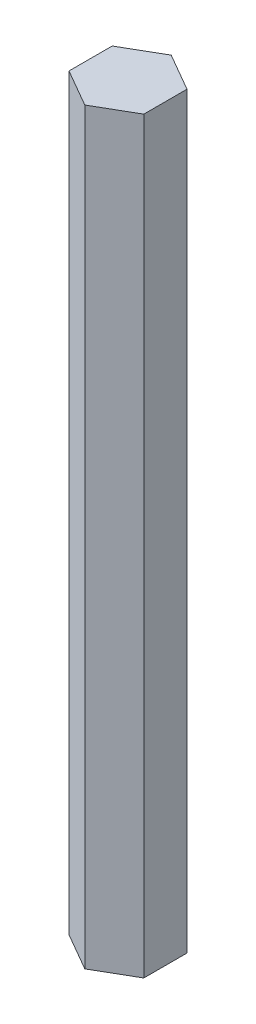
ISO-10303-21;
HEADER;
FILE_DESCRIPTION(('STEP AP214'),'2;1');
FILE_NAME('part.step','',(''),(''),'','','');
FILE_SCHEMA(('AUTOMOTIVE_DESIGN { 1 0 10303 214 1 1 1 1 }'));
ENDSEC;
DATA;
#1=APPLICATION_CONTEXT('core data for automotive mechanical design processes');
#2=APPLICATION_PROTOCOL_DEFINITION('international standard','automotive_design',2000,#1);
#3=PRODUCT_CONTEXT('',#1,'mechanical');
#4=PRODUCT('Part','Part','',(#3));
#5=PRODUCT_RELATED_PRODUCT_CATEGORY('part','',(#4));
#6=PRODUCT_DEFINITION_FORMATION('','',#4);
#7=PRODUCT_DEFINITION_CONTEXT('part definition',#1,'design');
#8=PRODUCT_DEFINITION('design','',#6,#7);
#9=PRODUCT_DEFINITION_SHAPE('','',#8);
#10=(LENGTH_UNIT() NAMED_UNIT(*) SI_UNIT(.MILLI.,.METRE.));
#11=(NAMED_UNIT(*) PLANE_ANGLE_UNIT() SI_UNIT($,.RADIAN.));
#12=(NAMED_UNIT(*) SI_UNIT($,.STERADIAN.) SOLID_ANGLE_UNIT());
#13=UNCERTAINTY_MEASURE_WITH_UNIT(LENGTH_MEASURE(1.E-05),#10,'distance_accuracy_value','');
#14=(GEOMETRIC_REPRESENTATION_CONTEXT(3) GLOBAL_UNCERTAINTY_ASSIGNED_CONTEXT((#13)) GLOBAL_UNIT_ASSIGNED_CONTEXT((#10,
#11,#12)) REPRESENTATION_CONTEXT('',''));
#15=CARTESIAN_POINT('',(0.,0.,0.));
#16=DIRECTION('',(0.,0.,1.));
#17=DIRECTION('',(1.,0.,0.));
#18=AXIS2_PLACEMENT_3D('',#15,#16,#17);
#19=CARTESIAN_POINT('',(6.34999999999995,127.,-3.66617420935419));
#20=DIRECTION('',(-0.499999999999995,0.,0.866025403784441));
#21=DIRECTION('',(0.866025403784442,0.,0.499999999999995));
#22=AXIS2_PLACEMENT_3D('',#19,#20,#21);
#23=PLANE('',#22);
#24=DIRECTION('',(-0.866025403784441,0.,-0.499999999999995));
#25=VECTOR('',#24,1.);
#26=CARTESIAN_POINT('',(6.34999999999995,0.,-3.66617420935419));
#27=LINE('',#26,#25);
#28=CARTESIAN_POINT('',(6.34999999999995,0.,-3.66617420935419));
#29=VERTEX_POINT('',#28);
#30=CARTESIAN_POINT('',(0.,0.,-7.33234841870823));
#31=VERTEX_POINT('',#30);
#32=EDGE_CURVE('E116',#29,#31,#27,.T.);
#33=ORIENTED_EDGE('',*,*,#32,.T.);
#34=DIRECTION('',(0.,-1.,0.));
#35=VECTOR('',#34,1.);
#36=CARTESIAN_POINT('',(0.,127.,-7.33234841870823));
#37=LINE('',#36,#35);
#38=CARTESIAN_POINT('',(0.,127.,-7.33234841870823));
#39=VERTEX_POINT('',#38);
#40=EDGE_CURVE('E11',#39,#31,#37,.T.);
#41=ORIENTED_EDGE('',*,*,#40,.F.);
#42=DIRECTION('',(-0.866025403784441,0.,-0.499999999999995));
#43=VECTOR('',#42,1.);
#44=CARTESIAN_POINT('',(6.34999999999995,127.,-3.66617420935419));
#45=LINE('',#44,#43);
#46=CARTESIAN_POINT('',(6.34999999999995,127.,-3.66617420935419));
#47=VERTEX_POINT('',#46);
#48=EDGE_CURVE('E126',#47,#39,#45,.T.);
#49=ORIENTED_EDGE('',*,*,#48,.F.);
#50=DIRECTION('',(0.,-1.,0.));
#51=VECTOR('',#50,1.);
#52=CARTESIAN_POINT('',(6.34999999999995,127.,-3.66617420935419));
#53=LINE('',#52,#51);
#54=EDGE_CURVE('E112',#47,#29,#53,.T.);
#55=ORIENTED_EDGE('',*,*,#54,.T.);
#56=EDGE_LOOP('',(#33,#41,#49,#55));
#57=FACE_BOUND('',#56,.T.);
#58=ADVANCED_FACE('F32',(#57),#23,.F.);
#59=CARTESIAN_POINT('',(0.,127.,-7.33234841870823));
#60=DIRECTION('',(0.500000000000001,0.,0.866025403784438));
#61=DIRECTION('',(0.866025403784438,0.,-0.500000000000001));
#62=AXIS2_PLACEMENT_3D('',#59,#60,#61);
#63=PLANE('',#62);
#64=DIRECTION('',(-0.866025403784438,0.,0.500000000000001));
#65=VECTOR('',#64,1.);
#66=CARTESIAN_POINT('',(0.,0.,-7.33234841870823));
#67=LINE('',#66,#65);
#68=CARTESIAN_POINT('',(-6.35,0.,-3.6661742093541));
#69=VERTEX_POINT('',#68);
#70=EDGE_CURVE('E119',#31,#69,#67,.T.);
#71=ORIENTED_EDGE('',*,*,#70,.T.);
#72=DIRECTION('',(0.,-1.,0.));
#73=VECTOR('',#72,1.);
#74=CARTESIAN_POINT('',(-6.35,127.,-3.6661742093541));
#75=LINE('',#74,#73);
#76=CARTESIAN_POINT('',(-6.35,127.,-3.6661742093541));
#77=VERTEX_POINT('',#76);
#78=EDGE_CURVE('E40',#77,#69,#75,.T.);
#79=ORIENTED_EDGE('',*,*,#78,.F.);
#80=DIRECTION('',(-0.866025403784438,0.,0.500000000000001));
#81=VECTOR('',#80,1.);
#82=CARTESIAN_POINT('',(0.,127.,-7.33234841870823));
#83=LINE('',#82,#81);
#84=EDGE_CURVE('E85',#39,#77,#83,.T.);
#85=ORIENTED_EDGE('',*,*,#84,.F.);
#86=ORIENTED_EDGE('',*,*,#40,.T.);
#87=EDGE_LOOP('',(#71,#79,#85,#86));
#88=FACE_BOUND('',#87,.T.);
#89=ADVANCED_FACE('F150',(#88),#63,.F.);
#90=CARTESIAN_POINT('',(-6.35,127.,-3.6661742093541));
#91=DIRECTION('',(1.,0.,0.));
#92=DIRECTION('',(0.,0.,-1.));
#93=AXIS2_PLACEMENT_3D('',#90,#91,#92);
#94=PLANE('',#93);
#95=DIRECTION('',(0.,0.,1.));
#96=VECTOR('',#95,1.);
#97=CARTESIAN_POINT('',(-6.35,0.,-3.6661742093541));
#98=LINE('',#97,#96);
#99=CARTESIAN_POINT('',(-6.34999999999997,0.,3.66617420935415));
#100=VERTEX_POINT('',#99);
#101=EDGE_CURVE('E121',#69,#100,#98,.T.);
#102=ORIENTED_EDGE('',*,*,#101,.T.);
#103=DIRECTION('',(0.,-1.,0.));
#104=VECTOR('',#103,1.);
#105=CARTESIAN_POINT('',(-6.34999999999997,127.,3.66617420935415));
#106=LINE('',#105,#104);
#107=CARTESIAN_POINT('',(-6.34999999999997,127.,3.66617420935415));
#108=VERTEX_POINT('',#107);
#109=EDGE_CURVE('E107',#108,#100,#106,.T.);
#110=ORIENTED_EDGE('',*,*,#109,.F.);
#111=DIRECTION('',(0.,0.,1.));
#112=VECTOR('',#111,1.);
#113=CARTESIAN_POINT('',(-6.35,127.,-3.6661742093541));
#114=LINE('',#113,#112);
#115=EDGE_CURVE('E98',#77,#108,#114,.T.);
#116=ORIENTED_EDGE('',*,*,#115,.F.);
#117=ORIENTED_EDGE('',*,*,#78,.T.);
#118=EDGE_LOOP('',(#102,#110,#116,#117));
#119=FACE_BOUND('',#118,.T.);
#120=ADVANCED_FACE('F132',(#119),#94,.F.);
#121=CARTESIAN_POINT('',(-6.34999999999997,127.,3.66617420935415));
#122=DIRECTION('',(0.499999999999995,0.,-0.866025403784441));
#123=DIRECTION('',(-0.866025403784442,0.,-0.499999999999995));
#124=AXIS2_PLACEMENT_3D('',#121,#122,#123);
#125=PLANE('',#124);
#126=DIRECTION('',(0.866025403784441,0.,0.499999999999995));
#127=VECTOR('',#126,1.);
#128=CARTESIAN_POINT('',(-6.34999999999997,0.,3.66617420935415));
#129=LINE('',#128,#127);
#130=CARTESIAN_POINT('',(0.,0.,7.33234841870823));
#131=VERTEX_POINT('',#130);
#132=EDGE_CURVE('E106',#100,#131,#129,.T.);
#133=ORIENTED_EDGE('',*,*,#132,.T.);
#134=DIRECTION('',(0.,-1.,0.));
#135=VECTOR('',#134,1.);
#136=CARTESIAN_POINT('',(0.,127.,7.33234841870823));
#137=LINE('',#136,#135);
#138=CARTESIAN_POINT('',(0.,127.,7.33234841870823));
#139=VERTEX_POINT('',#138);
#140=EDGE_CURVE('E103',#139,#131,#137,.T.);
#141=ORIENTED_EDGE('',*,*,#140,.F.);
#142=DIRECTION('',(0.866025403784441,0.,0.499999999999995));
#143=VECTOR('',#142,1.);
#144=CARTESIAN_POINT('',(-6.34999999999997,127.,3.66617420935415));
#145=LINE('',#144,#143);
#146=EDGE_CURVE('E92',#108,#139,#145,.T.);
#147=ORIENTED_EDGE('',*,*,#146,.F.);
#148=ORIENTED_EDGE('',*,*,#109,.T.);
#149=EDGE_LOOP('',(#133,#141,#147,#148));
#150=FACE_BOUND('',#149,.T.);
#151=ADVANCED_FACE('F104',(#150),#125,.F.);
#152=CARTESIAN_POINT('',(0.,127.,7.33234841870823));
#153=DIRECTION('',(-0.500000000000007,0.,-0.866025403784435));
#154=DIRECTION('',(-0.866025403784435,0.,0.500000000000007));
#155=AXIS2_PLACEMENT_3D('',#152,#153,#154);
#156=PLANE('',#155);
#157=DIRECTION('',(0.866025403784435,0.,-0.500000000000007));
#158=VECTOR('',#157,1.);
#159=CARTESIAN_POINT('',(0.,0.,7.33234841870823));
#160=LINE('',#159,#158);
#161=CARTESIAN_POINT('',(6.35000000000002,0.,3.66617420935406));
#162=VERTEX_POINT('',#161);
#163=EDGE_CURVE('E71',#131,#162,#160,.T.);
#164=ORIENTED_EDGE('',*,*,#163,.T.);
#165=DIRECTION('',(0.,-1.,0.));
#166=VECTOR('',#165,1.);
#167=CARTESIAN_POINT('',(6.35000000000002,127.,3.66617420935406));
#168=LINE('',#167,#166);
#169=CARTESIAN_POINT('',(6.35000000000002,127.,3.66617420935406));
#170=VERTEX_POINT('',#169);
#171=EDGE_CURVE('E108',#170,#162,#168,.T.);
#172=ORIENTED_EDGE('',*,*,#171,.F.);
#173=DIRECTION('',(0.866025403784435,0.,-0.500000000000007));
#174=VECTOR('',#173,1.);
#175=CARTESIAN_POINT('',(0.,127.,7.33234841870823));
#176=LINE('',#175,#174);
#177=EDGE_CURVE('E96',#139,#170,#176,.T.);
#178=ORIENTED_EDGE('',*,*,#177,.F.);
#179=ORIENTED_EDGE('',*,*,#140,.T.);
#180=EDGE_LOOP('',(#164,#172,#178,#179));
#181=FACE_BOUND('',#180,.T.);
#182=ADVANCED_FACE('F110',(#181),#156,.F.);
#183=CARTESIAN_POINT('',(6.35000000000002,127.,3.66617420935406));
#184=DIRECTION('',(-1.,0.,0.));
#185=DIRECTION('',(0.,0.,1.));
#186=AXIS2_PLACEMENT_3D('',#183,#184,#185);
#187=PLANE('',#186);
#188=DIRECTION('',(0.,0.,-1.));
#189=VECTOR('',#188,1.);
#190=CARTESIAN_POINT('',(6.35000000000002,0.,3.66617420935406));
#191=LINE('',#190,#189);
#192=EDGE_CURVE('E77',#162,#29,#191,.T.);
#193=ORIENTED_EDGE('',*,*,#192,.T.);
#194=ORIENTED_EDGE('',*,*,#54,.F.);
#195=DIRECTION('',(0.,0.,-1.));
#196=VECTOR('',#195,1.);
#197=CARTESIAN_POINT('',(6.35000000000002,127.,3.66617420935406));
#198=LINE('',#197,#196);
#199=EDGE_CURVE('E48',#170,#47,#198,.T.);
#200=ORIENTED_EDGE('',*,*,#199,.F.);
#201=ORIENTED_EDGE('',*,*,#171,.T.);
#202=EDGE_LOOP('',(#193,#194,#200,#201));
#203=FACE_BOUND('',#202,.T.);
#204=ADVANCED_FACE('F139',(#203),#187,.F.);
#205=CARTESIAN_POINT('',(0.,127.,0.));
#206=DIRECTION('',(0.,1.,0.));
#207=DIRECTION('',(0.,0.,1.));
#208=AXIS2_PLACEMENT_3D('',#205,#206,#207);
#209=PLANE('',#208);
#210=ORIENTED_EDGE('',*,*,#48,.T.);
#211=ORIENTED_EDGE('',*,*,#84,.T.);
#212=ORIENTED_EDGE('',*,*,#115,.T.);
#213=ORIENTED_EDGE('',*,*,#146,.T.);
#214=ORIENTED_EDGE('',*,*,#177,.T.);
#215=ORIENTED_EDGE('',*,*,#199,.T.);
#216=EDGE_LOOP('',(#210,#211,#212,#213,#214,#215));
#217=FACE_BOUND('',#216,.T.);
#218=ADVANCED_FACE('F94',(#217),#209,.T.);
#219=CARTESIAN_POINT('',(0.,0.,0.));
#220=DIRECTION('',(0.,1.,0.));
#221=DIRECTION('',(0.,0.,1.));
#222=AXIS2_PLACEMENT_3D('',#219,#220,#221);
#223=PLANE('',#222);
#224=ORIENTED_EDGE('',*,*,#32,.F.);
#225=ORIENTED_EDGE('',*,*,#192,.F.);
#226=ORIENTED_EDGE('',*,*,#163,.F.);
#227=ORIENTED_EDGE('',*,*,#132,.F.);
#228=ORIENTED_EDGE('',*,*,#101,.F.);
#229=ORIENTED_EDGE('',*,*,#70,.F.);
#230=EDGE_LOOP('',(#224,#225,#226,#227,#228,#229));
#231=FACE_BOUND('',#230,.T.);
#232=ADVANCED_FACE('F135',(#231),#223,.F.);
#233=CLOSED_SHELL('',(#58,#89,#120,#151,#182,#204,#218,#232));
#234=MANIFOLD_SOLID_BREP('B2',#233);
#235=ADVANCED_BREP_SHAPE_REPRESENTATION('',(#18,#234),#14);
#236=SHAPE_DEFINITION_REPRESENTATION(#9,#235);
ENDSEC;
END-ISO-10303-21;
